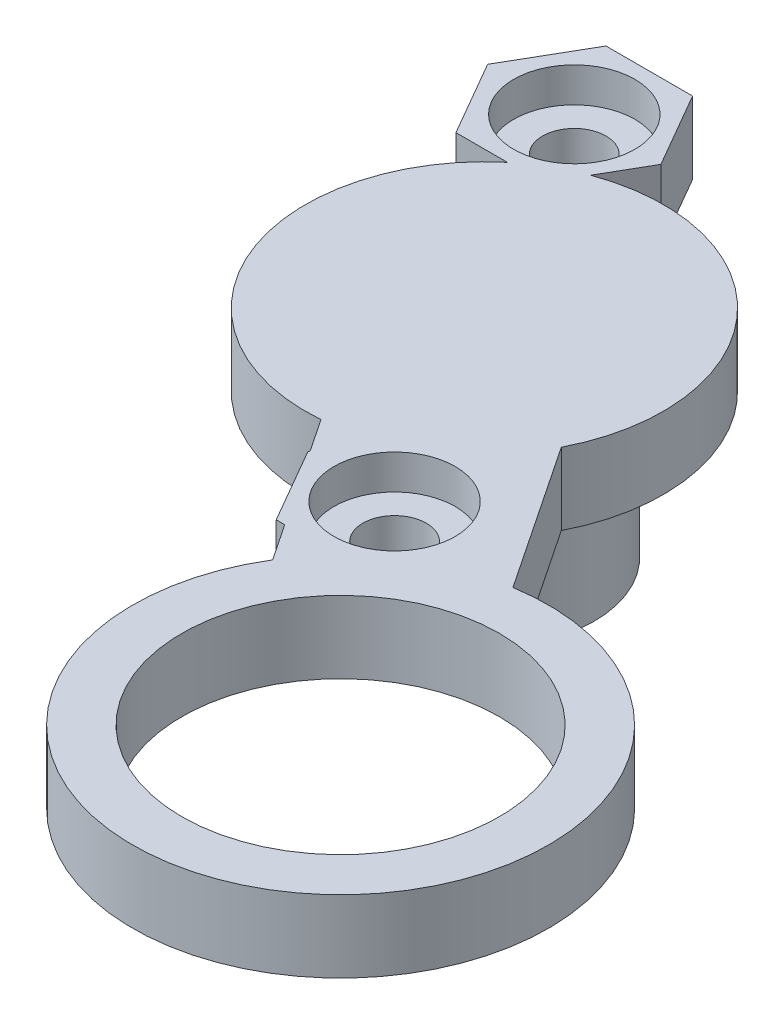
ISO-10303-21;
HEADER;
FILE_DESCRIPTION(('STEP AP214'),'2;1');
FILE_NAME('part.step','',(''),(''),'','','');
FILE_SCHEMA(('AUTOMOTIVE_DESIGN { 1 0 10303 214 1 1 1 1 }'));
ENDSEC;
DATA;
#1=APPLICATION_CONTEXT('core data for automotive mechanical design processes');
#2=APPLICATION_PROTOCOL_DEFINITION('international standard','automotive_design',2000,#1);
#3=PRODUCT_CONTEXT('',#1,'mechanical');
#4=PRODUCT('Part','Part','',(#3));
#5=PRODUCT_RELATED_PRODUCT_CATEGORY('part','',(#4));
#6=PRODUCT_DEFINITION_FORMATION('','',#4);
#7=PRODUCT_DEFINITION_CONTEXT('part definition',#1,'design');
#8=PRODUCT_DEFINITION('design','',#6,#7);
#9=PRODUCT_DEFINITION_SHAPE('','',#8);
#10=(LENGTH_UNIT() NAMED_UNIT(*) SI_UNIT(.MILLI.,.METRE.));
#11=(NAMED_UNIT(*) PLANE_ANGLE_UNIT() SI_UNIT($,.RADIAN.));
#12=(NAMED_UNIT(*) SI_UNIT($,.STERADIAN.) SOLID_ANGLE_UNIT());
#13=UNCERTAINTY_MEASURE_WITH_UNIT(LENGTH_MEASURE(1.E-05),#10,'distance_accuracy_value','');
#14=(GEOMETRIC_REPRESENTATION_CONTEXT(3) GLOBAL_UNCERTAINTY_ASSIGNED_CONTEXT((#13)) GLOBAL_UNIT_ASSIGNED_CONTEXT((#10,
#11,#12)) REPRESENTATION_CONTEXT('',''));
#15=CARTESIAN_POINT('',(0.,0.,0.));
#16=DIRECTION('',(0.,0.,1.));
#17=DIRECTION('',(1.,0.,0.));
#18=AXIS2_PLACEMENT_3D('',#15,#16,#17);
#19=CARTESIAN_POINT('',(-26.0608891324554,108.75,-7.63878406783228));
#20=DIRECTION('',(0.,-1.,0.));
#21=DIRECTION('',(0.,0.,1.));
#22=AXIS2_PLACEMENT_3D('',#19,#20,#21);
#23=CYLINDRICAL_SURFACE('',#22,1.1);
#24=CARTESIAN_POINT('',(-26.0608891324554,106.,-7.63878406783228));
#25=DIRECTION('',(0.,-1.,0.));
#26=DIRECTION('',(0.,0.,-1.));
#27=AXIS2_PLACEMENT_3D('',#24,#25,#26);
#28=CIRCLE('',#27,1.1);
#29=CARTESIAN_POINT('',(-26.0608891324554,106.,-8.73878406783228));
#30=VERTEX_POINT('',#29);
#31=EDGE_CURVE('E205',#30,#30,#28,.F.);
#32=ORIENTED_EDGE('',*,*,#31,.F.);
#33=EDGE_LOOP('',(#32));
#34=FACE_BOUND('',#33,.T.);
#35=CARTESIAN_POINT('',(-26.0608891324554,107.3,-7.63878406783228));
#36=DIRECTION('',(0.,-1.,0.));
#37=DIRECTION('',(0.,0.,-1.));
#38=AXIS2_PLACEMENT_3D('',#35,#36,#37);
#39=CIRCLE('',#38,1.1);
#40=CARTESIAN_POINT('',(-26.0608891324554,107.3,-8.73878406783228));
#41=VERTEX_POINT('',#40);
#42=EDGE_CURVE('E209',#41,#41,#39,.T.);
#43=ORIENTED_EDGE('',*,*,#42,.F.);
#44=EDGE_LOOP('',(#43));
#45=FACE_BOUND('',#44,.T.);
#46=ADVANCED_FACE('F41',(#34,#45),#23,.F.);
#47=CARTESIAN_POINT('',(-34.5608891324554,108.75,-22.3612159321677));
#48=DIRECTION('',(0.,-1.,0.));
#49=DIRECTION('',(0.,0.,1.));
#50=AXIS2_PLACEMENT_3D('',#47,#48,#49);
#51=CYLINDRICAL_SURFACE('',#50,1.1);
#52=CARTESIAN_POINT('',(-34.5608891324554,106.,-22.3612159321677));
#53=DIRECTION('',(0.,-1.,0.));
#54=DIRECTION('',(0.,0.,-1.));
#55=AXIS2_PLACEMENT_3D('',#52,#53,#54);
#56=CIRCLE('',#55,1.1);
#57=CARTESIAN_POINT('',(-34.5608891324554,106.,-23.4612159321677));
#58=VERTEX_POINT('',#57);
#59=EDGE_CURVE('E192',#58,#58,#56,.F.);
#60=ORIENTED_EDGE('',*,*,#59,.F.);
#61=EDGE_LOOP('',(#60));
#62=FACE_BOUND('',#61,.T.);
#63=CARTESIAN_POINT('',(-34.5608891324554,107.3,-22.3612159321677));
#64=DIRECTION('',(0.,-1.,0.));
#65=DIRECTION('',(0.,0.,-1.));
#66=AXIS2_PLACEMENT_3D('',#63,#64,#65);
#67=CIRCLE('',#66,1.1);
#68=CARTESIAN_POINT('',(-34.5608891324554,107.3,-23.4612159321677));
#69=VERTEX_POINT('',#68);
#70=EDGE_CURVE('E198',#69,#69,#67,.T.);
#71=ORIENTED_EDGE('',*,*,#70,.F.);
#72=EDGE_LOOP('',(#71));
#73=FACE_BOUND('',#72,.T.);
#74=ADVANCED_FACE('F355',(#62,#73),#51,.F.);
#75=CARTESIAN_POINT('',(-22.7863244619095,108.5,1.66631495995398));
#76=DIRECTION('',(0.83155773864033,0.,-0.555438319984659));
#77=DIRECTION('',(-0.555438319984659,0.,-0.83155773864033));
#78=AXIS2_PLACEMENT_3D('',#75,#76,#77);
#79=PLANE('',#78);
#80=DIRECTION('',(0.,-1.,0.));
#81=VECTOR('',#80,1.);
#82=CARTESIAN_POINT('',(-26.4217944999992,108.5,-3.77641942656093));
#83=LINE('',#82,#81);
#84=CARTESIAN_POINT('',(-26.4217944999992,106.,-3.77641942656093));
#85=VERTEX_POINT('',#84);
#86=CARTESIAN_POINT('',(-26.4217944999992,108.5,-3.77641942656093));
#87=VERTEX_POINT('',#86);
#88=EDGE_CURVE('E236',#85,#87,#83,.F.);
#89=ORIENTED_EDGE('',*,*,#88,.T.);
#90=DIRECTION('',(-0.555438319984659,0.,-0.83155773864033));
#91=VECTOR('',#90,1.);
#92=CARTESIAN_POINT('',(-22.7863244619095,108.5,1.66631495995398));
#93=LINE('',#92,#91);
#94=CARTESIAN_POINT('',(-27.266274935763,108.5,-5.04070785647896));
#95=VERTEX_POINT('',#94);
#96=EDGE_CURVE('E234',#87,#95,#93,.T.);
#97=ORIENTED_EDGE('',*,*,#96,.T.);
#98=DIRECTION('',(0.,1.,0.));
#99=VECTOR('',#98,1.);
#100=CARTESIAN_POINT('',(-27.266274935763,108.5,-5.04070785647896));
#101=LINE('',#100,#99);
#102=CARTESIAN_POINT('',(-27.266274935763,106.,-5.04070785647896));
#103=VERTEX_POINT('',#102);
#104=EDGE_CURVE('E187',#103,#95,#101,.T.);
#105=ORIENTED_EDGE('',*,*,#104,.F.);
#106=DIRECTION('',(-0.555438319984659,0.,-0.83155773864033));
#107=VECTOR('',#106,1.);
#108=CARTESIAN_POINT('',(-22.7863244619095,106.,1.66631495995398));
#109=LINE('',#108,#107);
#110=EDGE_CURVE('E243',#85,#103,#109,.T.);
#111=ORIENTED_EDGE('',*,*,#110,.F.);
#112=EDGE_LOOP('',(#89,#97,#105,#111));
#113=FACE_BOUND('',#112,.T.);
#114=ADVANCED_FACE('F363',(#113),#79,.F.);
#115=CARTESIAN_POINT('',(-27.8162159165344,108.5,-16.666314959954));
#116=DIRECTION('',(-0.83155773864033,0.,0.555438319984659));
#117=DIRECTION('',(0.555438319984659,0.,0.83155773864033));
#118=AXIS2_PLACEMENT_3D('',#115,#116,#117);
#119=PLANE('',#118);
#120=DIRECTION('',(0.,-1.,0.));
#121=VECTOR('',#120,1.);
#122=CARTESIAN_POINT('',(-21.4324480681573,108.5,-7.10904934646889));
#123=LINE('',#122,#121);
#124=CARTESIAN_POINT('',(-21.4324480681573,108.5,-7.10904934646889));
#125=VERTEX_POINT('',#124);
#126=CARTESIAN_POINT('',(-21.4324480681573,106.,-7.10904934646889));
#127=VERTEX_POINT('',#126);
#128=EDGE_CURVE('E49',#125,#127,#123,.T.);
#129=ORIENTED_EDGE('',*,*,#128,.T.);
#130=DIRECTION('',(0.555438319984659,0.,0.83155773864033));
#131=VECTOR('',#130,1.);
#132=CARTESIAN_POINT('',(-27.8162159165344,106.,-16.666314959954));
#133=LINE('',#132,#131);
#134=CARTESIAN_POINT('',(-24.8024831394074,106.,-12.1543957731699));
#135=VERTEX_POINT('',#134);
#136=EDGE_CURVE('E252',#135,#127,#133,.T.);
#137=ORIENTED_EDGE('',*,*,#136,.F.);
#138=DIRECTION('',(0.,-1.,0.));
#139=VECTOR('',#138,1.);
#140=CARTESIAN_POINT('',(-24.8024831394074,108.5,-12.1543957731699));
#141=LINE('',#140,#139);
#142=CARTESIAN_POINT('',(-24.8024831394074,108.5,-12.1543957731699));
#143=VERTEX_POINT('',#142);
#144=EDGE_CURVE('E172',#143,#135,#141,.T.);
#145=ORIENTED_EDGE('',*,*,#144,.F.);
#146=DIRECTION('',(0.555438319984659,0.,0.83155773864033));
#147=VECTOR('',#146,1.);
#148=CARTESIAN_POINT('',(-27.8162159165344,108.5,-16.666314959954));
#149=LINE('',#148,#147);
#150=EDGE_CURVE('E233',#143,#125,#149,.T.);
#151=ORIENTED_EDGE('',*,*,#150,.T.);
#152=EDGE_LOOP('',(#129,#137,#145,#151));
#153=FACE_BOUND('',#152,.T.);
#154=ADVANCED_FACE('F239',(#153),#119,.F.);
#155=CARTESIAN_POINT('',(-30.3108891324554,108.5,-15.));
#156=DIRECTION('',(0.,-1.,0.));
#157=DIRECTION('',(0.,0.,1.));
#158=AXIS2_PLACEMENT_3D('',#155,#156,#157);
#159=CYLINDRICAL_SURFACE('',#158,6.2);
#160=DIRECTION('',(0.,-1.,0.));
#161=VECTOR('',#160,1.);
#162=CARTESIAN_POINT('',(-29.7918295712494,108.5,-8.8217658532619));
#163=LINE('',#162,#161);
#164=CARTESIAN_POINT('',(-29.7918295712494,106.,-8.8217658532619));
#165=VERTEX_POINT('',#164);
#166=CARTESIAN_POINT('',(-29.7918295712494,108.5,-8.8217658532619));
#167=VERTEX_POINT('',#166);
#168=EDGE_CURVE('E179',#165,#167,#163,.F.);
#169=ORIENTED_EDGE('',*,*,#168,.T.);
#170=CARTESIAN_POINT('',(-30.3108891324554,108.5,-15.));
#171=DIRECTION('',(0.,-1.,0.));
#172=DIRECTION('',(0.,0.,-1.));
#173=AXIS2_PLACEMENT_3D('',#170,#171,#172);
#174=CIRCLE('',#173,6.2);
#175=CARTESIAN_POINT('',(-34.2798310569486,108.5,-19.7631397208144));
#176=VERTEX_POINT('',#175);
#177=EDGE_CURVE('E336',#167,#176,#174,.T.);
#178=ORIENTED_EDGE('',*,*,#177,.T.);
#179=DIRECTION('',(0.,-1.,0.));
#180=VECTOR('',#179,1.);
#181=CARTESIAN_POINT('',(-34.2798310569486,108.5,-19.7631397208144));
#182=LINE('',#181,#180);
#183=CARTESIAN_POINT('',(-34.2798310569486,106.,-19.7631397208144));
#184=VERTEX_POINT('',#183);
#185=EDGE_CURVE('E329',#176,#184,#182,.T.);
#186=ORIENTED_EDGE('',*,*,#185,.T.);
#187=CARTESIAN_POINT('',(-30.3108891324554,106.,-15.));
#188=DIRECTION('',(0.,-1.,0.));
#189=DIRECTION('',(0.,0.,-1.));
#190=AXIS2_PLACEMENT_3D('',#187,#188,#189);
#191=CIRCLE('',#190,6.2);
#192=EDGE_CURVE('E333',#165,#184,#191,.T.);
#193=ORIENTED_EDGE('',*,*,#192,.F.);
#194=EDGE_LOOP('',(#169,#178,#186,#193));
#195=FACE_BOUND('',#194,.T.);
#196=ADVANCED_FACE('F388',(#195),#159,.T.);
#197=ORIENTED_EDGE('',*,*,#144,.T.);
#198=CARTESIAN_POINT('',(-32.4514181702087,106.,-20.8187743931635));
#199=VERTEX_POINT('',#198);
#200=EDGE_CURVE('E251',#199,#135,#191,.T.);
#201=ORIENTED_EDGE('',*,*,#200,.F.);
#202=DIRECTION('',(0.,-1.,0.));
#203=VECTOR('',#202,1.);
#204=CARTESIAN_POINT('',(-32.4514181702087,108.5,-20.8187743931635));
#205=LINE('',#204,#203);
#206=CARTESIAN_POINT('',(-32.4514181702087,108.5,-20.8187743931635));
#207=VERTEX_POINT('',#206);
#208=EDGE_CURVE('E331',#199,#207,#205,.F.);
#209=ORIENTED_EDGE('',*,*,#208,.T.);
#210=EDGE_CURVE('E335',#207,#143,#174,.T.);
#211=ORIENTED_EDGE('',*,*,#210,.T.);
#212=EDGE_LOOP('',(#197,#201,#209,#211));
#213=FACE_BOUND('',#212,.T.);
#214=ADVANCED_FACE('F397',(#213),#159,.T.);
#215=CARTESIAN_POINT('',(-29.0608891324554,108.5,-7.63878406783228));
#216=DIRECTION('',(0.866025403784438,0.,0.5));
#217=DIRECTION('',(0.5,0.,-0.866025403784438));
#218=AXIS2_PLACEMENT_3D('',#215,#216,#217);
#219=PLANE('',#218);
#220=DIRECTION('',(0.,-1.,0.));
#221=VECTOR('',#220,1.);
#222=CARTESIAN_POINT('',(-29.0334281064459,108.5,-7.68634796010869));
#223=LINE('',#222,#221);
#224=CARTESIAN_POINT('',(-29.0334281064459,108.5,-7.68634796010869));
#225=VERTEX_POINT('',#224);
#226=CARTESIAN_POINT('',(-29.0334281064459,106.,-7.68634796010869));
#227=VERTEX_POINT('',#226);
#228=EDGE_CURVE('E261',#225,#227,#223,.T.);
#229=ORIENTED_EDGE('',*,*,#228,.T.);
#230=DIRECTION('',(0.5,0.,-0.866025403784438));
#231=VECTOR('',#230,1.);
#232=CARTESIAN_POINT('',(-29.0608891324554,106.,-7.63878406783228));
#233=LINE('',#232,#231);
#234=CARTESIAN_POINT('',(-29.0608891324554,106.,-7.63878406783228));
#235=VERTEX_POINT('',#234);
#236=EDGE_CURVE('E270',#235,#227,#233,.T.);
#237=ORIENTED_EDGE('',*,*,#236,.F.);
#238=DIRECTION('',(0.,-1.,0.));
#239=VECTOR('',#238,1.);
#240=CARTESIAN_POINT('',(-29.0608891324554,108.5,-7.63878406783228));
#241=LINE('',#240,#239);
#242=CARTESIAN_POINT('',(-29.0608891324554,108.5,-7.63878406783228));
#243=VERTEX_POINT('',#242);
#244=EDGE_CURVE('E274',#243,#235,#241,.T.);
#245=ORIENTED_EDGE('',*,*,#244,.F.);
#246=DIRECTION('',(0.5,0.,-0.866025403784438));
#247=VECTOR('',#246,1.);
#248=CARTESIAN_POINT('',(-29.0608891324554,108.5,-7.63878406783228));
#249=LINE('',#248,#247);
#250=EDGE_CURVE('E275',#243,#225,#249,.T.);
#251=ORIENTED_EDGE('',*,*,#250,.T.);
#252=EDGE_LOOP('',(#229,#237,#245,#251));
#253=FACE_BOUND('',#252,.T.);
#254=ADVANCED_FACE('F394',(#253),#219,.F.);
#255=CARTESIAN_POINT('',(-24.5608891324554,108.5,-5.04070785647896));
#256=DIRECTION('',(0.,0.,-1.));
#257=DIRECTION('',(-1.,0.,0.));
#258=AXIS2_PLACEMENT_3D('',#255,#256,#257);
#259=PLANE('',#258);
#260=ORIENTED_EDGE('',*,*,#104,.T.);
#261=DIRECTION('',(-1.,0.,0.));
#262=VECTOR('',#261,1.);
#263=CARTESIAN_POINT('',(-24.5608891324554,108.5,-5.04070785647896));
#264=LINE('',#263,#262);
#265=CARTESIAN_POINT('',(-27.5608891324554,108.5,-5.04070785647896));
#266=VERTEX_POINT('',#265);
#267=EDGE_CURVE('E266',#95,#266,#264,.T.);
#268=ORIENTED_EDGE('',*,*,#267,.T.);
#269=DIRECTION('',(0.,-1.,0.));
#270=VECTOR('',#269,1.);
#271=CARTESIAN_POINT('',(-27.5608891324554,108.5,-5.04070785647896));
#272=LINE('',#271,#270);
#273=CARTESIAN_POINT('',(-27.5608891324554,106.,-5.04070785647896));
#274=VERTEX_POINT('',#273);
#275=EDGE_CURVE('E281',#266,#274,#272,.T.);
#276=ORIENTED_EDGE('',*,*,#275,.T.);
#277=DIRECTION('',(-1.,0.,0.));
#278=VECTOR('',#277,1.);
#279=CARTESIAN_POINT('',(-24.5608891324554,106.,-5.04070785647896));
#280=LINE('',#279,#278);
#281=EDGE_CURVE('E173',#103,#274,#280,.T.);
#282=ORIENTED_EDGE('',*,*,#281,.F.);
#283=EDGE_LOOP('',(#260,#268,#276,#282));
#284=FACE_BOUND('',#283,.T.);
#285=ADVANCED_FACE('F396',(#284),#259,.F.);
#286=CARTESIAN_POINT('',(-30.3108891324554,106.02,-15.));
#287=DIRECTION('',(0.,-1.,0.));
#288=DIRECTION('',(0.,0.,1.));
#289=AXIS2_PLACEMENT_3D('',#286,#287,#288);
#290=CYLINDRICAL_SURFACE('',#289,3.8);
#291=CARTESIAN_POINT('',(-30.3108891324554,101.,-15.));
#292=DIRECTION('',(0.,-1.,0.));
#293=DIRECTION('',(0.,0.,-1.));
#294=AXIS2_PLACEMENT_3D('',#291,#292,#293);
#295=CIRCLE('',#294,3.8);
#296=CARTESIAN_POINT('',(-34.0630722359518,101.,-14.3990657624698));
#297=VERTEX_POINT('',#296);
#298=CARTESIAN_POINT('',(-29.9992809717437,101.,-11.2127978197385));
#299=VERTEX_POINT('',#298);
#300=EDGE_CURVE('E340',#297,#299,#295,.T.);
#301=ORIENTED_EDGE('',*,*,#300,.F.);
#302=CARTESIAN_POINT('',(-29.9990936060594,100.9998,-11.2128132407129));
#303=CARTESIAN_POINT('',(-30.0670392282905,101.072342110152,-11.2071924317569));
#304=CARTESIAN_POINT('',(-30.1384427308652,101.141737029236,-11.2031800244121));
#305=CARTESIAN_POINT('',(-30.2870375597555,101.2741615165,-11.1993554575045));
#306=CARTESIAN_POINT('',(-30.3642290028478,101.337190956191,-11.1995433827097));
#307=CARTESIAN_POINT('',(-30.5233696196391,101.456886305187,-11.2051067512917));
#308=CARTESIAN_POINT('',(-30.6053246932024,101.513544056817,-11.2104887621023));
#309=CARTESIAN_POINT('',(-30.7727850652044,101.620336946865,-11.2272389157684));
#310=CARTESIAN_POINT('',(-30.8582897715052,101.670473167462,-11.23860606387));
#311=CARTESIAN_POINT('',(-31.0216894112094,101.75869968596,-11.2662599660654));
#312=CARTESIAN_POINT('',(-31.0993178157952,101.797512633648,-11.2818238865246));
#313=CARTESIAN_POINT('',(-31.2557187213186,101.86987515176,-11.3184588376373));
#314=CARTESIAN_POINT('',(-31.3344911058838,101.903425253509,-11.3395293117879));
#315=CARTESIAN_POINT('',(-31.4922763385444,101.96510164616,-11.3873679983923));
#316=CARTESIAN_POINT('',(-31.571288604743,101.9932364806,-11.4141270932981));
#317=CARTESIAN_POINT('',(-31.728886955565,102.044024535532,-11.4734761286719));
#318=CARTESIAN_POINT('',(-31.8074730591716,102.066678002182,-11.5060658071858));
#319=CARTESIAN_POINT('',(-31.9595066922925,102.105385136737,-11.5752835984315));
#320=CARTESIAN_POINT('',(-32.0330141390325,102.121713025434,-11.6116268569451));
#321=CARTESIAN_POINT('',(-32.1782807288927,102.149229670343,-11.6894649814123));
#322=CARTESIAN_POINT('',(-32.2500392185365,102.160416532726,-11.730961738651));
#323=CARTESIAN_POINT('',(-32.3911105144319,102.17756924396,-11.8188713638396));
#324=CARTESIAN_POINT('',(-32.4604239519339,102.183536450003,-11.865282950337));
#325=CARTESIAN_POINT('',(-32.5960174010497,102.190221249505,-11.9627025238169));
#326=CARTESIAN_POINT('',(-32.6622963284864,102.190936981028,-12.013712134564));
#327=CARTESIAN_POINT('',(-32.8472967398228,102.185424591192,-12.1661119153657));
#328=CARTESIAN_POINT('',(-32.9615974696543,102.172629334172,-12.2727976450869));
#329=CARTESIAN_POINT('',(-33.1745270586437,102.128913957544,-12.4972898067947));
#330=CARTESIAN_POINT('',(-33.2731601317283,102.09799872196,-12.6150932349635));
#331=CARTESIAN_POINT('',(-33.4533840421461,102.018550534102,-12.8581161439467));
#332=CARTESIAN_POINT('',(-33.5349255115896,101.969967626041,-12.9833558022623));
#333=CARTESIAN_POINT('',(-33.6801021732066,101.855858350757,-13.236556615624));
#334=CARTESIAN_POINT('',(-33.7437224355728,101.790317943255,-13.3645199448262));
#335=CARTESIAN_POINT('',(-33.8571883347709,101.638024621455,-13.6268602833714));
#336=CARTESIAN_POINT('',(-33.9058429852257,101.550154500005,-13.7611009471761));
#337=CARTESIAN_POINT('',(-33.985209486157,101.356314064967,-14.0213209405645));
#338=CARTESIAN_POINT('',(-34.0159551600863,101.250378363221,-14.1473154418161));
#339=CARTESIAN_POINT('',(-34.0438114477498,101.113686188711,-14.2887764793012));
#340=CARTESIAN_POINT('',(-34.0480257754014,101.091350519122,-14.3112884456115));
#341=CARTESIAN_POINT('',(-34.0559398230363,101.046051944822,-14.3557176626996));
#342=CARTESIAN_POINT('',(-34.0596400621782,101.023089701324,-14.3776354951944));
#343=CARTESIAN_POINT('',(-34.063101961667,100.9998,-14.3992513967554));
#344=B_SPLINE_CURVE_WITH_KNOTS('',3,(#302,#303,#304,#305,#306,#307,#308,#309,#310,#311,#312,
#313,#314,#315,#316,#317,#318,#319,#320,#321,#322,#323,#324,#325,#326,#327,#328,#329,#330,#331,
#332,#333,#334,#335,#336,#337,#338,#339,#340,#341,#342,#343),.UNSPECIFIED.,.F.,.F.,(4,2,2,2,2,2,
2,2,2,2,2,2,2,2,2,2,2,2,2,2,4),(0.,0.298502367110102,0.597010758387164,0.895897080679035,
1.19473374252968,1.45893687456312,1.72311331603081,1.9868694935179,2.25061382405023,
2.50111827840569,2.75171493870102,3.00224642058703,3.25286672539199,3.72104449842141,
4.18909613775274,4.65848162776413,5.12825700492775,5.62913773764794,6.12906939821765,
6.22503537633674,6.32090372644162),.UNSPECIFIED.);
#345=EDGE_CURVE('E168',#299,#297,#344,.T.);
#346=ORIENTED_EDGE('',*,*,#345,.F.);
#347=EDGE_LOOP('',(#301,#346));
#348=FACE_BOUND('',#347,.T.);
#349=CARTESIAN_POINT('',(-30.3108891324554,106.,-15.));
#350=DIRECTION('',(0.,-1.,0.));
#351=DIRECTION('',(0.,0.,-1.));
#352=AXIS2_PLACEMENT_3D('',#349,#350,#351);
#353=CIRCLE('',#352,3.8);
#354=CARTESIAN_POINT('',(-30.3108891324554,106.,-18.8));
#355=VERTEX_POINT('',#354);
#356=EDGE_CURVE('E183',#355,#355,#353,.T.);
#357=ORIENTED_EDGE('',*,*,#356,.T.);
#358=EDGE_LOOP('',(#357));
#359=FACE_BOUND('',#358,.T.);
#360=ADVANCED_FACE('F43',(#348,#359),#290,.T.);
#361=CARTESIAN_POINT('',(-30.3108891324554,101.,-15.));
#362=DIRECTION('',(0.,1.,0.));
#363=DIRECTION('',(0.,0.,-1.));
#364=AXIS2_PLACEMENT_3D('',#361,#362,#363);
#365=PLANE('',#364);
#366=ORIENTED_EDGE('',*,*,#300,.T.);
#367=CARTESIAN_POINT('',(-31.835817099933,101.,-13.0550948431946));
#368=DIRECTION('',(0.,-1.,0.));
#369=DIRECTION('',(-0.617017715423195,0.,0.786949260660394));
#370=AXIS2_PLACEMENT_3D('',#367,#368,#369);
#371=ELLIPSE('',#370,5.40311255334571,2.58643522865266);
#372=CARTESIAN_POINT('',(-29.4158821665001,101.,-11.9798240894128));
#373=VERTEX_POINT('',#372);
#374=EDGE_CURVE('E167',#373,#299,#371,.T.);
#375=ORIENTED_EDGE('',*,*,#374,.F.);
#376=CARTESIAN_POINT('',(-30.3108891324554,101.,-15.));
#377=DIRECTION('',(0.,-1.,0.));
#378=DIRECTION('',(0.,0.,-1.));
#379=AXIS2_PLACEMENT_3D('',#376,#377,#378);
#380=CIRCLE('',#379,3.15);
#381=CARTESIAN_POINT('',(-33.4573814589928,101.,-15.1486137242689));
#382=VERTEX_POINT('',#381);
#383=EDGE_CURVE('E160',#382,#373,#380,.T.);
#384=ORIENTED_EDGE('',*,*,#383,.F.);
#385=EDGE_CURVE('E161',#297,#382,#371,.T.);
#386=ORIENTED_EDGE('',*,*,#385,.F.);
#387=EDGE_LOOP('',(#366,#375,#384,#386));
#388=FACE_BOUND('',#387,.T.);
#389=ADVANCED_FACE('F175',(#388),#365,.F.);
#390=CARTESIAN_POINT('',(-30.3108891324554,108.5,-15.));
#391=DIRECTION('',(0.,1.,0.));
#392=DIRECTION('',(0.,0.,-1.));
#393=AXIS2_PLACEMENT_3D('',#390,#391,#392);
#394=PLANE('',#393);
#395=CARTESIAN_POINT('',(-26.0608891324554,108.5,-7.63878406783228));
#396=DIRECTION('',(0.,-1.,0.));
#397=DIRECTION('',(0.,0.,-1.));
#398=AXIS2_PLACEMENT_3D('',#395,#396,#397);
#399=CIRCLE('',#398,2.1);
#400=CARTESIAN_POINT('',(-26.0608891324554,108.5,-9.73878406783228));
#401=VERTEX_POINT('',#400);
#402=EDGE_CURVE('E206',#401,#401,#399,.F.);
#403=ORIENTED_EDGE('',*,*,#402,.F.);
#404=EDGE_LOOP('',(#403));
#405=FACE_BOUND('',#404,.T.);
#406=CARTESIAN_POINT('',(-34.5608891324554,108.5,-22.3612159321677));
#407=DIRECTION('',(0.,-1.,0.));
#408=DIRECTION('',(0.,0.,-1.));
#409=AXIS2_PLACEMENT_3D('',#406,#407,#408);
#410=CIRCLE('',#409,2.1);
#411=CARTESIAN_POINT('',(-34.5608891324554,108.5,-24.4612159321677));
#412=VERTEX_POINT('',#411);
#413=EDGE_CURVE('E199',#412,#412,#410,.F.);
#414=ORIENTED_EDGE('',*,*,#413,.F.);
#415=EDGE_LOOP('',(#414));
#416=FACE_BOUND('',#415,.T.);
#417=CARTESIAN_POINT('',(-20.2916512459885,108.5,0.));
#418=DIRECTION('',(0.,-1.,0.));
#419=DIRECTION('',(0.,0.,-1.));
#420=AXIS2_PLACEMENT_3D('',#417,#418,#419);
#421=CIRCLE('',#420,5.5);
#422=CARTESIAN_POINT('',(-20.2916512459885,108.5,5.5));
#423=VERTEX_POINT('',#422);
#424=EDGE_CURVE('E193',#423,#423,#421,.F.);
#425=ORIENTED_EDGE('',*,*,#424,.F.);
#426=EDGE_LOOP('',(#425));
#427=FACE_BOUND('',#426,.T.);
#428=CARTESIAN_POINT('',(-20.2916512459885,108.5,0.));
#429=DIRECTION('',(0.,-1.,0.));
#430=DIRECTION('',(0.,0.,-1.));
#431=AXIS2_PLACEMENT_3D('',#428,#429,#430);
#432=CIRCLE('',#431,7.2);
#433=EDGE_CURVE('E65',#125,#87,#432,.T.);
#434=ORIENTED_EDGE('',*,*,#433,.F.);
#435=ORIENTED_EDGE('',*,*,#150,.F.);
#436=ORIENTED_EDGE('',*,*,#210,.F.);
#437=DIRECTION('',(-0.5,0.,0.866025403784439));
#438=VECTOR('',#437,1.);
#439=CARTESIAN_POINT('',(-31.5608891324554,108.5,-22.3612159321677));
#440=LINE('',#439,#438);
#441=CARTESIAN_POINT('',(-31.5608891324554,108.5,-22.3612159321677));
#442=VERTEX_POINT('',#441);
#443=EDGE_CURVE('E289',#442,#207,#440,.T.);
#444=ORIENTED_EDGE('',*,*,#443,.F.);
#445=DIRECTION('',(0.500000000000001,0.,0.866025403784438));
#446=VECTOR('',#445,1.);
#447=CARTESIAN_POINT('',(-33.0608891324554,108.5,-24.9592921435211));
#448=LINE('',#447,#446);
#449=CARTESIAN_POINT('',(-33.0608891324554,108.5,-24.9592921435211));
#450=VERTEX_POINT('',#449);
#451=EDGE_CURVE('E285',#450,#442,#448,.T.);
#452=ORIENTED_EDGE('',*,*,#451,.F.);
#453=DIRECTION('',(1.,0.,0.));
#454=VECTOR('',#453,1.);
#455=CARTESIAN_POINT('',(-36.0608891324554,108.5,-24.9592921435211));
#456=LINE('',#455,#454);
#457=CARTESIAN_POINT('',(-36.0608891324554,108.5,-24.9592921435211));
#458=VERTEX_POINT('',#457);
#459=EDGE_CURVE('E297',#458,#450,#456,.T.);
#460=ORIENTED_EDGE('',*,*,#459,.F.);
#461=DIRECTION('',(0.500000000000001,0.,-0.866025403784438));
#462=VECTOR('',#461,1.);
#463=CARTESIAN_POINT('',(-37.5608891324554,108.5,-22.3612159321677));
#464=LINE('',#463,#462);
#465=CARTESIAN_POINT('',(-37.5608891324554,108.5,-22.3612159321677));
#466=VERTEX_POINT('',#465);
#467=EDGE_CURVE('E300',#466,#458,#464,.T.);
#468=ORIENTED_EDGE('',*,*,#467,.F.);
#469=DIRECTION('',(-0.5,0.,-0.866025403784439));
#470=VECTOR('',#469,1.);
#471=CARTESIAN_POINT('',(-36.0608891324554,108.5,-19.7631397208144));
#472=LINE('',#471,#470);
#473=CARTESIAN_POINT('',(-36.0608891324554,108.5,-19.7631397208144));
#474=VERTEX_POINT('',#473);
#475=EDGE_CURVE('E295',#474,#466,#472,.T.);
#476=ORIENTED_EDGE('',*,*,#475,.F.);
#477=DIRECTION('',(-1.,0.,0.));
#478=VECTOR('',#477,1.);
#479=CARTESIAN_POINT('',(-33.0608891324554,108.5,-19.7631397208144));
#480=LINE('',#479,#478);
#481=EDGE_CURVE('E293',#176,#474,#480,.T.);
#482=ORIENTED_EDGE('',*,*,#481,.F.);
#483=ORIENTED_EDGE('',*,*,#177,.F.);
#484=EDGE_CURVE('E245',#225,#167,#93,.T.);
#485=ORIENTED_EDGE('',*,*,#484,.F.);
#486=ORIENTED_EDGE('',*,*,#250,.F.);
#487=DIRECTION('',(-0.5,0.,-0.866025403784439));
#488=VECTOR('',#487,1.);
#489=CARTESIAN_POINT('',(-27.5608891324554,108.5,-5.04070785647896));
#490=LINE('',#489,#488);
#491=EDGE_CURVE('E268',#266,#243,#490,.T.);
#492=ORIENTED_EDGE('',*,*,#491,.F.);
#493=ORIENTED_EDGE('',*,*,#267,.F.);
#494=ORIENTED_EDGE('',*,*,#96,.F.);
#495=EDGE_LOOP('',(#434,#435,#436,#444,#452,#460,#468,#476,#482,#483,#485,#486,#492,#493,#494));
#496=FACE_BOUND('',#495,.T.);
#497=ADVANCED_FACE('F219',(#405,#416,#427,#496),#394,.T.);
#498=CARTESIAN_POINT('',(-30.3108891324554,106.,-15.));
#499=DIRECTION('',(0.,1.,0.));
#500=DIRECTION('',(0.,0.,-1.));
#501=AXIS2_PLACEMENT_3D('',#498,#499,#500);
#502=PLANE('',#501);
#503=ORIENTED_EDGE('',*,*,#31,.T.);
#504=EDGE_LOOP('',(#503));
#505=FACE_BOUND('',#504,.T.);
#506=ORIENTED_EDGE('',*,*,#59,.T.);
#507=EDGE_LOOP('',(#506));
#508=FACE_BOUND('',#507,.T.);
#509=CARTESIAN_POINT('',(-20.2916512459885,106.,0.));
#510=DIRECTION('',(0.,-1.,0.));
#511=DIRECTION('',(0.,0.,-1.));
#512=AXIS2_PLACEMENT_3D('',#509,#510,#511);
#513=CIRCLE('',#512,5.5);
#514=CARTESIAN_POINT('',(-20.2916512459885,106.,5.5));
#515=VERTEX_POINT('',#514);
#516=EDGE_CURVE('E194',#515,#515,#513,.F.);
#517=ORIENTED_EDGE('',*,*,#516,.T.);
#518=EDGE_LOOP('',(#517));
#519=FACE_BOUND('',#518,.T.);
#520=ORIENTED_EDGE('',*,*,#110,.T.);
#521=ORIENTED_EDGE('',*,*,#281,.T.);
#522=DIRECTION('',(-0.5,0.,-0.866025403784439));
#523=VECTOR('',#522,1.);
#524=CARTESIAN_POINT('',(-27.5608891324554,106.,-5.04070785647896));
#525=LINE('',#524,#523);
#526=EDGE_CURVE('E180',#274,#235,#525,.T.);
#527=ORIENTED_EDGE('',*,*,#526,.T.);
#528=ORIENTED_EDGE('',*,*,#236,.T.);
#529=EDGE_CURVE('E253',#227,#165,#109,.T.);
#530=ORIENTED_EDGE('',*,*,#529,.T.);
#531=ORIENTED_EDGE('',*,*,#192,.T.);
#532=DIRECTION('',(-1.,0.,0.));
#533=VECTOR('',#532,1.);
#534=CARTESIAN_POINT('',(-33.0608891324554,106.,-19.7631397208144));
#535=LINE('',#534,#533);
#536=CARTESIAN_POINT('',(-36.0608891324554,106.,-19.7631397208144));
#537=VERTEX_POINT('',#536);
#538=EDGE_CURVE('E308',#184,#537,#535,.T.);
#539=ORIENTED_EDGE('',*,*,#538,.T.);
#540=DIRECTION('',(-0.5,0.,-0.866025403784439));
#541=VECTOR('',#540,1.);
#542=CARTESIAN_POINT('',(-36.0608891324554,106.,-19.7631397208144));
#543=LINE('',#542,#541);
#544=CARTESIAN_POINT('',(-37.5608891324554,106.,-22.3612159321677));
#545=VERTEX_POINT('',#544);
#546=EDGE_CURVE('E311',#537,#545,#543,.T.);
#547=ORIENTED_EDGE('',*,*,#546,.T.);
#548=DIRECTION('',(0.500000000000001,0.,-0.866025403784438));
#549=VECTOR('',#548,1.);
#550=CARTESIAN_POINT('',(-37.5608891324554,106.,-22.3612159321677));
#551=LINE('',#550,#549);
#552=CARTESIAN_POINT('',(-36.0608891324554,106.,-24.9592921435211));
#553=VERTEX_POINT('',#552);
#554=EDGE_CURVE('E313',#545,#553,#551,.T.);
#555=ORIENTED_EDGE('',*,*,#554,.T.);
#556=DIRECTION('',(1.,0.,0.));
#557=VECTOR('',#556,1.);
#558=CARTESIAN_POINT('',(-36.0608891324554,106.,-24.9592921435211));
#559=LINE('',#558,#557);
#560=CARTESIAN_POINT('',(-33.0608891324554,106.,-24.9592921435211));
#561=VERTEX_POINT('',#560);
#562=EDGE_CURVE('E288',#553,#561,#559,.T.);
#563=ORIENTED_EDGE('',*,*,#562,.T.);
#564=DIRECTION('',(0.500000000000001,0.,0.866025403784438));
#565=VECTOR('',#564,1.);
#566=CARTESIAN_POINT('',(-33.0608891324554,106.,-24.9592921435211));
#567=LINE('',#566,#565);
#568=CARTESIAN_POINT('',(-31.5608891324554,106.,-22.3612159321677));
#569=VERTEX_POINT('',#568);
#570=EDGE_CURVE('E283',#561,#569,#567,.T.);
#571=ORIENTED_EDGE('',*,*,#570,.T.);
#572=DIRECTION('',(-0.5,0.,0.866025403784439));
#573=VECTOR('',#572,1.);
#574=CARTESIAN_POINT('',(-31.5608891324554,106.,-22.3612159321677));
#575=LINE('',#574,#573);
#576=EDGE_CURVE('E306',#569,#199,#575,.T.);
#577=ORIENTED_EDGE('',*,*,#576,.T.);
#578=ORIENTED_EDGE('',*,*,#200,.T.);
#579=ORIENTED_EDGE('',*,*,#136,.T.);
#580=CARTESIAN_POINT('',(-20.2916512459885,106.,0.));
#581=DIRECTION('',(0.,-1.,0.));
#582=DIRECTION('',(0.,0.,-1.));
#583=AXIS2_PLACEMENT_3D('',#580,#581,#582);
#584=CIRCLE('',#583,7.2);
#585=EDGE_CURVE('E240',#127,#85,#584,.T.);
#586=ORIENTED_EDGE('',*,*,#585,.T.);
#587=EDGE_LOOP('',(#520,#521,#527,#528,#530,#531,#539,#547,#555,#563,#571,#577,#578,#579,#586));
#588=FACE_BOUND('',#587,.T.);
#589=ORIENTED_EDGE('',*,*,#356,.F.);
#590=EDGE_LOOP('',(#589));
#591=FACE_BOUND('',#590,.T.);
#592=ADVANCED_FACE('F221',(#505,#508,#519,#588,#591),#502,.F.);
#593=CARTESIAN_POINT('',(-31.5608891324554,108.5,-22.3612159321677));
#594=DIRECTION('',(-0.866025403784439,0.,-0.5));
#595=DIRECTION('',(-0.5,0.,0.866025403784439));
#596=AXIS2_PLACEMENT_3D('',#593,#594,#595);
#597=PLANE('',#596);
#598=ORIENTED_EDGE('',*,*,#576,.F.);
#599=DIRECTION('',(0.,-1.,0.));
#600=VECTOR('',#599,1.);
#601=CARTESIAN_POINT('',(-31.5608891324554,108.5,-22.3612159321677));
#602=LINE('',#601,#600);
#603=EDGE_CURVE('E326',#442,#569,#602,.T.);
#604=ORIENTED_EDGE('',*,*,#603,.F.);
#605=ORIENTED_EDGE('',*,*,#443,.T.);
#606=ORIENTED_EDGE('',*,*,#208,.F.);
#607=EDGE_LOOP('',(#598,#604,#605,#606));
#608=FACE_BOUND('',#607,.T.);
#609=ADVANCED_FACE('F345',(#608),#597,.F.);
#610=CARTESIAN_POINT('',(-33.0608891324554,108.5,-19.7631397208144));
#611=DIRECTION('',(0.,0.,-1.));
#612=DIRECTION('',(-1.,0.,0.));
#613=AXIS2_PLACEMENT_3D('',#610,#611,#612);
#614=PLANE('',#613);
#615=ORIENTED_EDGE('',*,*,#481,.T.);
#616=DIRECTION('',(0.,-1.,0.));
#617=VECTOR('',#616,1.);
#618=CARTESIAN_POINT('',(-36.0608891324554,108.5,-19.7631397208144));
#619=LINE('',#618,#617);
#620=EDGE_CURVE('E323',#474,#537,#619,.T.);
#621=ORIENTED_EDGE('',*,*,#620,.T.);
#622=ORIENTED_EDGE('',*,*,#538,.F.);
#623=ORIENTED_EDGE('',*,*,#185,.F.);
#624=EDGE_LOOP('',(#615,#621,#622,#623));
#625=FACE_BOUND('',#624,.T.);
#626=ADVANCED_FACE('F348',(#625),#614,.F.);
#627=CARTESIAN_POINT('',(-33.0608891324554,108.5,-24.9592921435211));
#628=DIRECTION('',(-0.866025403784438,0.,0.500000000000001));
#629=DIRECTION('',(0.500000000000001,0.,0.866025403784438));
#630=AXIS2_PLACEMENT_3D('',#627,#628,#629);
#631=PLANE('',#630);
#632=ORIENTED_EDGE('',*,*,#570,.F.);
#633=DIRECTION('',(0.,-1.,0.));
#634=VECTOR('',#633,1.);
#635=CARTESIAN_POINT('',(-33.0608891324554,108.5,-24.9592921435211));
#636=LINE('',#635,#634);
#637=EDGE_CURVE('E303',#450,#561,#636,.T.);
#638=ORIENTED_EDGE('',*,*,#637,.F.);
#639=ORIENTED_EDGE('',*,*,#451,.T.);
#640=ORIENTED_EDGE('',*,*,#603,.T.);
#641=EDGE_LOOP('',(#632,#638,#639,#640));
#642=FACE_BOUND('',#641,.T.);
#643=ADVANCED_FACE('F416',(#642),#631,.F.);
#644=CARTESIAN_POINT('',(-36.0608891324554,108.5,-19.7631397208144));
#645=DIRECTION('',(0.866025403784439,0.,-0.5));
#646=DIRECTION('',(-0.5,0.,-0.866025403784439));
#647=AXIS2_PLACEMENT_3D('',#644,#645,#646);
#648=PLANE('',#647);
#649=ORIENTED_EDGE('',*,*,#546,.F.);
#650=ORIENTED_EDGE('',*,*,#620,.F.);
#651=ORIENTED_EDGE('',*,*,#475,.T.);
#652=DIRECTION('',(0.,-1.,0.));
#653=VECTOR('',#652,1.);
#654=CARTESIAN_POINT('',(-37.5608891324554,108.5,-22.3612159321677));
#655=LINE('',#654,#653);
#656=EDGE_CURVE('E321',#466,#545,#655,.T.);
#657=ORIENTED_EDGE('',*,*,#656,.T.);
#658=EDGE_LOOP('',(#649,#650,#651,#657));
#659=FACE_BOUND('',#658,.T.);
#660=ADVANCED_FACE('F412',(#659),#648,.F.);
#661=CARTESIAN_POINT('',(-37.5608891324554,108.5,-22.3612159321677));
#662=DIRECTION('',(0.866025403784438,0.,0.500000000000001));
#663=DIRECTION('',(0.500000000000001,0.,-0.866025403784438));
#664=AXIS2_PLACEMENT_3D('',#661,#662,#663);
#665=PLANE('',#664);
#666=ORIENTED_EDGE('',*,*,#554,.F.);
#667=ORIENTED_EDGE('',*,*,#656,.F.);
#668=ORIENTED_EDGE('',*,*,#467,.T.);
#669=DIRECTION('',(0.,-1.,0.));
#670=VECTOR('',#669,1.);
#671=CARTESIAN_POINT('',(-36.0608891324554,108.5,-24.9592921435211));
#672=LINE('',#671,#670);
#673=EDGE_CURVE('E318',#458,#553,#672,.T.);
#674=ORIENTED_EDGE('',*,*,#673,.T.);
#675=EDGE_LOOP('',(#666,#667,#668,#674));
#676=FACE_BOUND('',#675,.T.);
#677=ADVANCED_FACE('F410',(#676),#665,.F.);
#678=CARTESIAN_POINT('',(-36.0608891324554,108.5,-24.9592921435211));
#679=DIRECTION('',(0.,0.,1.));
#680=DIRECTION('',(1.,0.,0.));
#681=AXIS2_PLACEMENT_3D('',#678,#679,#680);
#682=PLANE('',#681);
#683=ORIENTED_EDGE('',*,*,#562,.F.);
#684=ORIENTED_EDGE('',*,*,#673,.F.);
#685=ORIENTED_EDGE('',*,*,#459,.T.);
#686=ORIENTED_EDGE('',*,*,#637,.T.);
#687=EDGE_LOOP('',(#683,#684,#685,#686));
#688=FACE_BOUND('',#687,.T.);
#689=ADVANCED_FACE('F402',(#688),#682,.F.);
#690=CARTESIAN_POINT('',(-27.5608891324554,108.5,-5.04070785647896));
#691=DIRECTION('',(0.866025403784438,0.,-0.5));
#692=DIRECTION('',(-0.5,0.,-0.866025403784438));
#693=AXIS2_PLACEMENT_3D('',#690,#691,#692);
#694=PLANE('',#693);
#695=ORIENTED_EDGE('',*,*,#526,.F.);
#696=ORIENTED_EDGE('',*,*,#275,.F.);
#697=ORIENTED_EDGE('',*,*,#491,.T.);
#698=ORIENTED_EDGE('',*,*,#244,.T.);
#699=EDGE_LOOP('',(#695,#696,#697,#698));
#700=FACE_BOUND('',#699,.T.);
#701=ADVANCED_FACE('F392',(#700),#694,.F.);
#702=CARTESIAN_POINT('',(-30.3108891324554,101.,-15.));
#703=DIRECTION('',(0.,0.,-1.));
#704=DIRECTION('',(-1.,0.,0.));
#705=AXIS2_PLACEMENT_3D('',#702,#703,#704);
#706=SPHERICAL_SURFACE('',#705,3.15);
#707=ORIENTED_EDGE('',*,*,#383,.T.);
#708=CARTESIAN_POINT('',(-31.1104183662697,100.17230473673,-13.9802741093179));
#709=DIRECTION('',(-0.51999029893439,-0.538308656109163,0.663199728416765));
#710=DIRECTION('',(0.,-0.776423951617283,-0.630210954645349));
#711=AXIS2_PLACEMENT_3D('',#708,#709,#710);
#712=CIRCLE('',#711,2.74924219800811);
#713=EDGE_CURVE('E11',#382,#373,#712,.F.);
#714=ORIENTED_EDGE('',*,*,#713,.F.);
#715=EDGE_LOOP('',(#707,#714));
#716=FACE_BOUND('',#715,.T.);
#717=ADVANCED_FACE('F159',(#716),#706,.F.);
#718=ORIENTED_EDGE('',*,*,#529,.F.);
#719=ORIENTED_EDGE('',*,*,#228,.F.);
#720=ORIENTED_EDGE('',*,*,#484,.T.);
#721=ORIENTED_EDGE('',*,*,#168,.F.);
#722=EDGE_LOOP('',(#718,#719,#720,#721));
#723=FACE_BOUND('',#722,.T.);
#724=ADVANCED_FACE('F384',(#723),#79,.F.);
#725=CARTESIAN_POINT('',(-20.2916512459885,108.5,0.));
#726=DIRECTION('',(0.,-1.,0.));
#727=DIRECTION('',(0.,0.,1.));
#728=AXIS2_PLACEMENT_3D('',#725,#726,#727);
#729=CYLINDRICAL_SURFACE('',#728,7.2);
#730=ORIENTED_EDGE('',*,*,#585,.F.);
#731=ORIENTED_EDGE('',*,*,#128,.F.);
#732=ORIENTED_EDGE('',*,*,#433,.T.);
#733=ORIENTED_EDGE('',*,*,#88,.F.);
#734=EDGE_LOOP('',(#730,#731,#732,#733));
#735=FACE_BOUND('',#734,.T.);
#736=ADVANCED_FACE('F244',(#735),#729,.T.);
#737=CARTESIAN_POINT('',(-20.2916512459885,108.6,0.));
#738=DIRECTION('',(0.,-1.,0.));
#739=DIRECTION('',(0.,0.,1.));
#740=AXIS2_PLACEMENT_3D('',#737,#738,#739);
#741=CYLINDRICAL_SURFACE('',#740,5.5);
#742=CARTESIAN_POINT('',(-20.2916512459885,108.5,5.5));
#743=CARTESIAN_POINT('',(-20.2916512459885,108.473958333333,5.5));
#744=CARTESIAN_POINT('',(-20.2916512459885,108.447916666667,5.5));
#745=CARTESIAN_POINT('',(-20.2916512459885,108.395833333333,5.5));
#746=CARTESIAN_POINT('',(-20.2916512459885,108.369791666667,5.5));
#747=CARTESIAN_POINT('',(-20.2916512459885,108.317708333333,5.5));
#748=CARTESIAN_POINT('',(-20.2916512459885,108.291666666667,5.5));
#749=CARTESIAN_POINT('',(-20.2916512459885,108.239583333333,5.5));
#750=CARTESIAN_POINT('',(-20.2916512459885,108.213541666667,5.5));
#751=CARTESIAN_POINT('',(-20.2916512459885,108.161458333333,5.5));
#752=CARTESIAN_POINT('',(-20.2916512459885,108.135416666667,5.5));
#753=CARTESIAN_POINT('',(-20.2916512459885,108.083333333333,5.5));
#754=CARTESIAN_POINT('',(-20.2916512459885,108.057291666667,5.5));
#755=CARTESIAN_POINT('',(-20.2916512459885,108.005208333333,5.5));
#756=CARTESIAN_POINT('',(-20.2916512459885,107.979166666667,5.5));
#757=CARTESIAN_POINT('',(-20.2916512459885,107.927083333333,5.5));
#758=CARTESIAN_POINT('',(-20.2916512459885,107.901041666667,5.5));
#759=CARTESIAN_POINT('',(-20.2916512459885,107.848958333333,5.5));
#760=CARTESIAN_POINT('',(-20.2916512459885,107.822916666667,5.5));
#761=CARTESIAN_POINT('',(-20.2916512459885,107.770833333333,5.5));
#762=CARTESIAN_POINT('',(-20.2916512459885,107.744791666667,5.5));
#763=CARTESIAN_POINT('',(-20.2916512459885,107.692708333333,5.5));
#764=CARTESIAN_POINT('',(-20.2916512459885,107.666666666667,5.5));
#765=CARTESIAN_POINT('',(-20.2916512459885,107.614583333333,5.5));
#766=CARTESIAN_POINT('',(-20.2916512459885,107.588541666667,5.5));
#767=CARTESIAN_POINT('',(-20.2916512459885,107.536458333333,5.5));
#768=CARTESIAN_POINT('',(-20.2916512459885,107.510416666667,5.5));
#769=CARTESIAN_POINT('',(-20.2916512459885,107.458333333333,5.5));
#770=CARTESIAN_POINT('',(-20.2916512459885,107.432291666667,5.5));
#771=CARTESIAN_POINT('',(-20.2916512459885,107.380208333333,5.5));
#772=CARTESIAN_POINT('',(-20.2916512459885,107.354166666667,5.5));
#773=CARTESIAN_POINT('',(-20.2916512459885,107.302083333333,5.5));
#774=CARTESIAN_POINT('',(-20.2916512459885,107.276041666667,5.5));
#775=CARTESIAN_POINT('',(-20.2916512459885,107.223958333333,5.5));
#776=CARTESIAN_POINT('',(-20.2916512459885,107.197916666667,5.5));
#777=CARTESIAN_POINT('',(-20.2916512459885,107.145833333333,5.5));
#778=CARTESIAN_POINT('',(-20.2916512459885,107.119791666667,5.5));
#779=CARTESIAN_POINT('',(-20.2916512459885,107.067708333333,5.5));
#780=CARTESIAN_POINT('',(-20.2916512459885,107.041666666667,5.5));
#781=CARTESIAN_POINT('',(-20.2916512459885,106.989583333333,5.5));
#782=CARTESIAN_POINT('',(-20.2916512459885,106.963541666667,5.5));
#783=CARTESIAN_POINT('',(-20.2916512459885,106.911458333333,5.5));
#784=CARTESIAN_POINT('',(-20.2916512459885,106.885416666667,5.5));
#785=CARTESIAN_POINT('',(-20.2916512459885,106.833333333333,5.5));
#786=CARTESIAN_POINT('',(-20.2916512459885,106.807291666667,5.5));
#787=CARTESIAN_POINT('',(-20.2916512459885,106.755208333333,5.5));
#788=CARTESIAN_POINT('',(-20.2916512459885,106.729166666667,5.5));
#789=CARTESIAN_POINT('',(-20.2916512459885,106.677083333333,5.5));
#790=CARTESIAN_POINT('',(-20.2916512459885,106.651041666667,5.5));
#791=CARTESIAN_POINT('',(-20.2916512459885,106.598958333333,5.5));
#792=CARTESIAN_POINT('',(-20.2916512459885,106.572916666667,5.5));
#793=CARTESIAN_POINT('',(-20.2916512459885,106.520833333333,5.5));
#794=CARTESIAN_POINT('',(-20.2916512459885,106.494791666667,5.5));
#795=CARTESIAN_POINT('',(-20.2916512459885,106.442708333333,5.5));
#796=CARTESIAN_POINT('',(-20.2916512459885,106.416666666667,5.5));
#797=CARTESIAN_POINT('',(-20.2916512459885,106.364583333333,5.5));
#798=CARTESIAN_POINT('',(-20.2916512459885,106.338541666667,5.5));
#799=CARTESIAN_POINT('',(-20.2916512459885,106.286458333333,5.5));
#800=CARTESIAN_POINT('',(-20.2916512459885,106.260416666667,5.5));
#801=CARTESIAN_POINT('',(-20.2916512459885,106.208333333333,5.5));
#802=CARTESIAN_POINT('',(-20.2916512459885,106.182291666667,5.5));
#803=CARTESIAN_POINT('',(-20.2916512459885,106.130208333333,5.5));
#804=CARTESIAN_POINT('',(-20.2916512459885,106.104166666667,5.5));
#805=CARTESIAN_POINT('',(-20.2916512459885,106.052083333333,5.5));
#806=CARTESIAN_POINT('',(-20.2916512459885,106.026041666667,5.5));
#807=CARTESIAN_POINT('',(-20.2916512459885,106.,5.5));
#808=B_SPLINE_CURVE_WITH_KNOTS('',3,(#742,#743,#744,#745,#746,#747,#748,#749,#750,#751,#752,
#753,#754,#755,#756,#757,#758,#759,#760,#761,#762,#763,#764,#765,#766,#767,#768,#769,#770,#771,
#772,#773,#774,#775,#776,#777,#778,#779,#780,#781,#782,#783,#784,#785,#786,#787,#788,#789,#790,
#791,#792,#793,#794,#795,#796,#797,#798,#799,#800,#801,#802,#803,#804,#805,#806,#807),
.UNSPECIFIED.,.F.,.F.,(4,2,2,2,2,2,2,2,2,2,2,2,2,2,2,2,2,2,2,2,2,2,2,2,2,2,2,2,2,2,2,2,4),(0.,
0.0781249999999983,0.156249999999997,0.234374999999995,0.312499999999993,0.390624999999992,
0.46874999999999,0.546874999999988,0.625000000000001,0.703124999999999,0.781249999999997,
0.859374999999996,0.937499999999994,1.01562499999999,1.09374999999999,1.17187499999999,1.25,
1.328125,1.40625,1.484375,1.56249999999999,1.64062499999999,1.71874999999999,1.79687499999999,
1.875,1.953125,2.03125,2.109375,2.1875,2.26562499999999,2.34374999999999,2.42187499999999,2.5),.UNSPECIFIED.);
#809=EDGE_CURVE('BSEAM374',#423,#515,#808,.T.);
#810=ORIENTED_EDGE('',*,*,#424,.T.);
#811=ORIENTED_EDGE('',*,*,#516,.F.);
#812=ORIENTED_EDGE('',*,*,#809,.T.);
#813=ORIENTED_EDGE('',*,*,#809,.F.);
#814=EDGE_LOOP('',(#810,#812,#811,#813));
#815=FACE_BOUND('',#814,.T.);
#816=ADVANCED_FACE('F374',(#815),#741,.F.);
#817=CARTESIAN_POINT('',(-34.5608891324554,108.75,-22.3612159321677));
#818=DIRECTION('',(0.,-1.,0.));
#819=DIRECTION('',(0.,0.,1.));
#820=AXIS2_PLACEMENT_3D('',#817,#818,#819);
#821=CYLINDRICAL_SURFACE('',#820,2.1);
#822=ORIENTED_EDGE('',*,*,#413,.T.);
#823=EDGE_LOOP('',(#822));
#824=FACE_BOUND('',#823,.T.);
#825=CARTESIAN_POINT('',(-34.5608891324554,107.3,-22.3612159321677));
#826=DIRECTION('',(0.,-1.,0.));
#827=DIRECTION('',(0.,0.,-1.));
#828=AXIS2_PLACEMENT_3D('',#825,#826,#827);
#829=CIRCLE('',#828,2.1);
#830=CARTESIAN_POINT('',(-34.5608891324554,107.3,-24.4612159321677));
#831=VERTEX_POINT('',#830);
#832=EDGE_CURVE('E202',#831,#831,#829,.T.);
#833=ORIENTED_EDGE('',*,*,#832,.T.);
#834=EDGE_LOOP('',(#833));
#835=FACE_BOUND('',#834,.T.);
#836=ADVANCED_FACE('F375',(#824,#835),#821,.F.);
#837=CARTESIAN_POINT('',(-34.5608891324554,107.3,-22.3612159321677));
#838=DIRECTION('',(0.,1.,0.));
#839=DIRECTION('',(0.,0.,-1.));
#840=AXIS2_PLACEMENT_3D('',#837,#838,#839);
#841=PLANE('',#840);
#842=ORIENTED_EDGE('',*,*,#70,.T.);
#843=EDGE_LOOP('',(#842));
#844=FACE_BOUND('',#843,.T.);
#845=ORIENTED_EDGE('',*,*,#832,.F.);
#846=EDGE_LOOP('',(#845));
#847=FACE_BOUND('',#846,.T.);
#848=ADVANCED_FACE('F367',(#844,#847),#841,.T.);
#849=CARTESIAN_POINT('',(-26.0608891324554,108.75,-7.63878406783228));
#850=DIRECTION('',(0.,-1.,0.));
#851=DIRECTION('',(0.,0.,1.));
#852=AXIS2_PLACEMENT_3D('',#849,#850,#851);
#853=CYLINDRICAL_SURFACE('',#852,2.1);
#854=ORIENTED_EDGE('',*,*,#402,.T.);
#855=EDGE_LOOP('',(#854));
#856=FACE_BOUND('',#855,.T.);
#857=CARTESIAN_POINT('',(-26.0608891324554,107.3,-7.63878406783228));
#858=DIRECTION('',(0.,-1.,0.));
#859=DIRECTION('',(0.,0.,-1.));
#860=AXIS2_PLACEMENT_3D('',#857,#858,#859);
#861=CIRCLE('',#860,2.1);
#862=CARTESIAN_POINT('',(-26.0608891324554,107.3,-9.73878406783228));
#863=VERTEX_POINT('',#862);
#864=EDGE_CURVE('E214',#863,#863,#861,.T.);
#865=ORIENTED_EDGE('',*,*,#864,.T.);
#866=EDGE_LOOP('',(#865));
#867=FACE_BOUND('',#866,.T.);
#868=ADVANCED_FACE('F212',(#856,#867),#853,.F.);
#869=CARTESIAN_POINT('',(-26.0608891324554,107.3,-7.63878406783228));
#870=DIRECTION('',(0.,1.,0.));
#871=DIRECTION('',(0.,0.,-1.));
#872=AXIS2_PLACEMENT_3D('',#869,#870,#871);
#873=PLANE('',#872);
#874=ORIENTED_EDGE('',*,*,#42,.T.);
#875=EDGE_LOOP('',(#874));
#876=FACE_BOUND('',#875,.T.);
#877=ORIENTED_EDGE('',*,*,#864,.F.);
#878=EDGE_LOOP('',(#877));
#879=FACE_BOUND('',#878,.T.);
#880=ADVANCED_FACE('F459',(#876,#879),#873,.T.);
#881=CARTESIAN_POINT('',(-30.3108891324553,101.,-15.));
#882=DIRECTION('',(-0.51999029893439,-0.538308656109163,0.663199728416765));
#883=DIRECTION('',(0.,0.776423951617283,0.630210954645349));
#884=AXIS2_PLACEMENT_3D('',#881,#882,#883);
#885=CONICAL_SURFACE('',#884,2.29999999999998,0.284261523704203);
#886=ORIENTED_EDGE('',*,*,#374,.T.);
#887=ORIENTED_EDGE('',*,*,#345,.T.);
#888=ORIENTED_EDGE('',*,*,#385,.T.);
#889=ORIENTED_EDGE('',*,*,#713,.T.);
#890=EDGE_LOOP('',(#886,#887,#888,#889));
#891=FACE_BOUND('',#890,.T.);
#892=ADVANCED_FACE('F165',(#891),#885,.F.);
#893=CLOSED_SHELL('',(#46,#74,#114,#154,#196,#214,#254,#285,#360,#389,#497,#592,#609,#626,#643,
#660,#677,#689,#701,#717,#724,#736,#816,#836,#848,#868,#880,#892));
#894=MANIFOLD_SOLID_BREP('B2',#893);
#895=ADVANCED_BREP_SHAPE_REPRESENTATION('',(#18,#894),#14);
#896=SHAPE_DEFINITION_REPRESENTATION(#9,#895);
ENDSEC;
END-ISO-10303-21;
